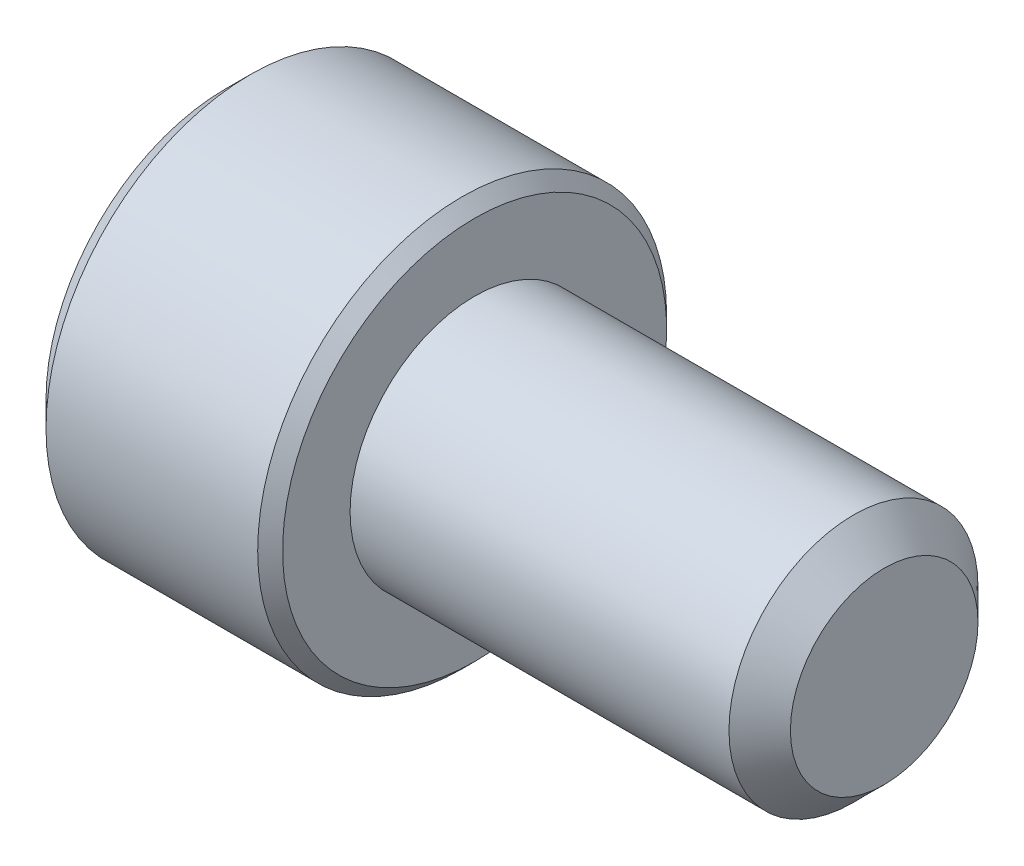
ISO-10303-21;
HEADER;
FILE_DESCRIPTION(('STEP AP214'),'2;1');
FILE_NAME('part.step','',(''),(''),'','','');
FILE_SCHEMA(('AUTOMOTIVE_DESIGN { 1 0 10303 214 1 1 1 1 }'));
ENDSEC;
DATA;
#1=APPLICATION_CONTEXT('core data for automotive mechanical design processes');
#2=APPLICATION_PROTOCOL_DEFINITION('international standard','automotive_design',2000,#1);
#3=PRODUCT_CONTEXT('',#1,'mechanical');
#4=PRODUCT('Part','Part','',(#3));
#5=PRODUCT_RELATED_PRODUCT_CATEGORY('part','',(#4));
#6=PRODUCT_DEFINITION_FORMATION('','',#4);
#7=PRODUCT_DEFINITION_CONTEXT('part definition',#1,'design');
#8=PRODUCT_DEFINITION('design','',#6,#7);
#9=PRODUCT_DEFINITION_SHAPE('','',#8);
#10=(LENGTH_UNIT() NAMED_UNIT(*) SI_UNIT(.MILLI.,.METRE.));
#11=(NAMED_UNIT(*) PLANE_ANGLE_UNIT() SI_UNIT($,.RADIAN.));
#12=(NAMED_UNIT(*) SI_UNIT($,.STERADIAN.) SOLID_ANGLE_UNIT());
#13=UNCERTAINTY_MEASURE_WITH_UNIT(LENGTH_MEASURE(1.E-05),#10,'distance_accuracy_value','');
#14=(GEOMETRIC_REPRESENTATION_CONTEXT(3) GLOBAL_UNCERTAINTY_ASSIGNED_CONTEXT((#13)) GLOBAL_UNIT_ASSIGNED_CONTEXT((#10,
#11,#12)) REPRESENTATION_CONTEXT('',''));
#15=CARTESIAN_POINT('',(0.,0.,0.));
#16=DIRECTION('',(0.,0.,1.));
#17=DIRECTION('',(1.,0.,0.));
#18=AXIS2_PLACEMENT_3D('',#15,#16,#17);
#19=CARTESIAN_POINT('',(-8.79475,3.4798,0.));
#20=DIRECTION('',(-1.,0.,0.));
#21=DIRECTION('',(0.,-1.,0.));
#22=AXIS2_PLACEMENT_3D('',#19,#20,#21);
#23=PLANE('',#22);
#24=CARTESIAN_POINT('',(-8.79475,0.,0.));
#25=DIRECTION('',(-1.,0.,0.));
#26=DIRECTION('',(0.,-1.,0.));
#27=AXIS2_PLACEMENT_3D('',#24,#25,#26);
#28=CIRCLE('',#27,2.29135888084631);
#29=CARTESIAN_POINT('',(-8.79475000000001,-2.29135888084629,0.));
#30=VERTEX_POINT('',#29);
#31=CARTESIAN_POINT('',(-8.79475,-1.1456794404232,1.98437499999995));
#32=VERTEX_POINT('',#31);
#33=EDGE_CURVE('E134',#30,#32,#28,.T.);
#34=ORIENTED_EDGE('',*,*,#33,.F.);
#35=CARTESIAN_POINT('',(-8.79475,-1.14567944042316,-1.984375));
#36=VERTEX_POINT('',#35);
#37=EDGE_CURVE('E133',#36,#30,#28,.T.);
#38=ORIENTED_EDGE('',*,*,#37,.F.);
#39=CARTESIAN_POINT('',(-8.79475,1.14567944042314,-1.984375));
#40=VERTEX_POINT('',#39);
#41=EDGE_CURVE('E102',#40,#36,#28,.T.);
#42=ORIENTED_EDGE('',*,*,#41,.F.);
#43=CARTESIAN_POINT('',(-8.79474999999999,2.29135888084633,0.));
#44=VERTEX_POINT('',#43);
#45=EDGE_CURVE('E95',#44,#40,#28,.T.);
#46=ORIENTED_EDGE('',*,*,#45,.F.);
#47=CARTESIAN_POINT('',(-8.79475,1.14567944042314,1.984375));
#48=VERTEX_POINT('',#47);
#49=EDGE_CURVE('E56',#48,#44,#28,.T.);
#50=ORIENTED_EDGE('',*,*,#49,.F.);
#51=EDGE_CURVE('E63',#32,#48,#28,.T.);
#52=ORIENTED_EDGE('',*,*,#51,.F.);
#53=EDGE_LOOP('',(#34,#38,#42,#46,#50,#52));
#54=FACE_BOUND('',#53,.T.);
#55=CARTESIAN_POINT('',(-8.79475,0.,0.));
#56=DIRECTION('',(1.,0.,0.));
#57=DIRECTION('',(0.,1.,0.));
#58=AXIS2_PLACEMENT_3D('',#55,#56,#57);
#59=CIRCLE('',#58,3.4798);
#60=CARTESIAN_POINT('',(-8.79475,3.4798,0.));
#61=VERTEX_POINT('',#60);
#62=EDGE_CURVE('E227',#61,#61,#59,.T.);
#63=ORIENTED_EDGE('',*,*,#62,.F.);
#64=EDGE_LOOP('',(#63));
#65=FACE_BOUND('',#64,.T.);
#66=ADVANCED_FACE('F36',(#54,#65),#23,.T.);
#67=CARTESIAN_POINT('',(-3.96875,0.,0.));
#68=DIRECTION('',(1.,0.,0.));
#69=DIRECTION('',(0.,0.,-1.));
#70=AXIS2_PLACEMENT_3D('',#67,#68,#69);
#71=CYLINDRICAL_SURFACE('',#70,2.413);
#72=CARTESIAN_POINT('',(3.3734375,0.,0.));
#73=DIRECTION('',(1.,0.,0.));
#74=DIRECTION('',(0.,0.,-1.));
#75=AXIS2_PLACEMENT_3D('',#72,#73,#74);
#76=CIRCLE('',#75,2.413);
#77=CARTESIAN_POINT('',(3.3734375,0.,-2.413));
#78=VERTEX_POINT('',#77);
#79=EDGE_CURVE('E50',#78,#78,#76,.F.);
#80=ORIENTED_EDGE('',*,*,#79,.T.);
#81=EDGE_LOOP('',(#80));
#82=FACE_BOUND('',#81,.T.);
#83=CARTESIAN_POINT('',(-3.96875,0.,0.));
#84=DIRECTION('',(1.,0.,0.));
#85=DIRECTION('',(0.,1.,0.));
#86=AXIS2_PLACEMENT_3D('',#83,#84,#85);
#87=CIRCLE('',#86,2.413);
#88=CARTESIAN_POINT('',(-3.96875,2.41299999999999,0.));
#89=VERTEX_POINT('',#88);
#90=EDGE_CURVE('E220',#89,#89,#87,.F.);
#91=ORIENTED_EDGE('',*,*,#90,.F.);
#92=EDGE_LOOP('',(#91));
#93=FACE_BOUND('',#92,.T.);
#94=ADVANCED_FACE('F200',(#82,#93),#71,.T.);
#95=CARTESIAN_POINT('',(3.96875,0.,0.));
#96=DIRECTION('',(1.,0.,0.));
#97=DIRECTION('',(0.,0.,-1.));
#98=AXIS2_PLACEMENT_3D('',#95,#96,#97);
#99=PLANE('',#98);
#100=CARTESIAN_POINT('',(3.96875,0.,0.));
#101=DIRECTION('',(1.,0.,0.));
#102=DIRECTION('',(0.,0.,-1.));
#103=AXIS2_PLACEMENT_3D('',#100,#101,#102);
#104=CIRCLE('',#103,1.8176875);
#105=CARTESIAN_POINT('',(3.96875,0.,-1.8176875));
#106=VERTEX_POINT('',#105);
#107=EDGE_CURVE('E221',#106,#106,#104,.T.);
#108=ORIENTED_EDGE('',*,*,#107,.T.);
#109=EDGE_LOOP('',(#108));
#110=FACE_BOUND('',#109,.T.);
#111=ADVANCED_FACE('F208',(#110),#99,.T.);
#112=CARTESIAN_POINT('',(3.96875,0.,0.));
#113=DIRECTION('',(-1.,0.,0.));
#114=DIRECTION('',(0.,0.,1.));
#115=AXIS2_PLACEMENT_3D('',#112,#113,#114);
#116=CONICAL_SURFACE('',#115,1.8176875,0.785398163397448);
#117=ORIENTED_EDGE('',*,*,#79,.F.);
#118=EDGE_LOOP('',(#117));
#119=FACE_BOUND('',#118,.T.);
#120=ORIENTED_EDGE('',*,*,#107,.F.);
#121=EDGE_LOOP('',(#120));
#122=FACE_BOUND('',#121,.T.);
#123=ADVANCED_FACE('F38',(#119,#122),#116,.T.);
#124=CARTESIAN_POINT('',(-3.96875,0.,0.));
#125=DIRECTION('',(1.,0.,0.));
#126=DIRECTION('',(0.,1.,0.));
#127=AXIS2_PLACEMENT_3D('',#124,#125,#126);
#128=CYLINDRICAL_SURFACE('',#127,3.9624);
#129=CARTESIAN_POINT('',(-8.31215,0.,0.));
#130=DIRECTION('',(1.,0.,0.));
#131=DIRECTION('',(0.,1.,0.));
#132=AXIS2_PLACEMENT_3D('',#129,#130,#131);
#133=CIRCLE('',#132,3.9624);
#134=CARTESIAN_POINT('',(-8.31215,3.9624,0.));
#135=VERTEX_POINT('',#134);
#136=EDGE_CURVE('E222',#135,#135,#133,.T.);
#137=ORIENTED_EDGE('',*,*,#136,.T.);
#138=EDGE_LOOP('',(#137));
#139=FACE_BOUND('',#138,.T.);
#140=CARTESIAN_POINT('',(-4.21005,0.,0.));
#141=DIRECTION('',(1.,0.,0.));
#142=DIRECTION('',(0.,1.,0.));
#143=AXIS2_PLACEMENT_3D('',#140,#141,#142);
#144=CIRCLE('',#143,3.9624);
#145=CARTESIAN_POINT('',(-4.21005,3.9624,0.));
#146=VERTEX_POINT('',#145);
#147=EDGE_CURVE('E236',#146,#146,#144,.T.);
#148=ORIENTED_EDGE('',*,*,#147,.F.);
#149=EDGE_LOOP('',(#148));
#150=FACE_BOUND('',#149,.T.);
#151=ADVANCED_FACE('F203',(#139,#150),#128,.T.);
#152=CARTESIAN_POINT('',(-8.31215,0.,0.));
#153=DIRECTION('',(1.,0.,0.));
#154=DIRECTION('',(0.,1.,0.));
#155=AXIS2_PLACEMENT_3D('',#152,#153,#154);
#156=CONICAL_SURFACE('',#155,3.9624,0.78539816339745);
#157=ORIENTED_EDGE('',*,*,#62,.T.);
#158=EDGE_LOOP('',(#157));
#159=FACE_BOUND('',#158,.T.);
#160=ORIENTED_EDGE('',*,*,#136,.F.);
#161=EDGE_LOOP('',(#160));
#162=FACE_BOUND('',#161,.T.);
#163=ADVANCED_FACE('F196',(#159,#162),#156,.T.);
#164=CARTESIAN_POINT('',(-3.96875,3.7211,0.));
#165=DIRECTION('',(1.,0.,0.));
#166=DIRECTION('',(0.,1.,0.));
#167=AXIS2_PLACEMENT_3D('',#164,#165,#166);
#168=PLANE('',#167);
#169=ORIENTED_EDGE('',*,*,#90,.T.);
#170=EDGE_LOOP('',(#169));
#171=FACE_BOUND('',#170,.T.);
#172=CARTESIAN_POINT('',(-3.96875,0.,0.));
#173=DIRECTION('',(1.,0.,0.));
#174=DIRECTION('',(0.,1.,0.));
#175=AXIS2_PLACEMENT_3D('',#172,#173,#174);
#176=CIRCLE('',#175,3.7211);
#177=CARTESIAN_POINT('',(-3.96875,3.7211,0.));
#178=VERTEX_POINT('',#177);
#179=EDGE_CURVE('E233',#178,#178,#176,.T.);
#180=ORIENTED_EDGE('',*,*,#179,.T.);
#181=EDGE_LOOP('',(#180));
#182=FACE_BOUND('',#181,.T.);
#183=ADVANCED_FACE('F192',(#171,#182),#168,.T.);
#184=CARTESIAN_POINT('',(-3.96875,0.,0.));
#185=DIRECTION('',(-1.,0.,0.));
#186=DIRECTION('',(0.,-1.,0.));
#187=AXIS2_PLACEMENT_3D('',#184,#185,#186);
#188=CONICAL_SURFACE('',#187,3.7211,0.785398163397453);
#189=ORIENTED_EDGE('',*,*,#147,.T.);
#190=EDGE_LOOP('',(#189));
#191=FACE_BOUND('',#190,.T.);
#192=ORIENTED_EDGE('',*,*,#179,.F.);
#193=EDGE_LOOP('',(#192));
#194=FACE_BOUND('',#193,.T.);
#195=ADVANCED_FACE('F156',(#191,#194),#188,.T.);
#196=CARTESIAN_POINT('',(-8.79475,0.,0.));
#197=DIRECTION('',(-1.,0.,0.));
#198=DIRECTION('',(0.,-1.,0.));
#199=AXIS2_PLACEMENT_3D('',#196,#197,#198);
#200=CONICAL_SURFACE('',#199,2.29135888084631,0.78539816339745);
#201=CARTESIAN_POINT('',(-9.55676229336038,-2.3206316784124,-1.984375));
#202=CARTESIAN_POINT('',(-9.51394707270642,-2.26428478882583,-1.984375));
#203=CARTESIAN_POINT('',(-9.47153515492394,-2.20762644057207,-1.984375));
#204=CARTESIAN_POINT('',(-9.38769976145879,-2.09356244128209,-1.984375));
#205=CARTESIAN_POINT('',(-9.34627653152968,-2.03615660981659,-1.984375));
#206=CARTESIAN_POINT('',(-9.26430560751588,-1.92005329556712,-1.984375));
#207=CARTESIAN_POINT('',(-9.22376717145536,-1.86134925449791,-1.984375));
#208=CARTESIAN_POINT('',(-9.14416769497068,-1.7429510853472,-1.984375));
#209=CARTESIAN_POINT('',(-9.10510655113528,-1.6832570269898,-1.984375));
#210=CARTESIAN_POINT('',(-9.02653250731771,-1.5591477373728,-1.984375));
#211=CARTESIAN_POINT('',(-8.98712992174023,-1.49466231064595,-1.984375));
#212=CARTESIAN_POINT('',(-8.91086530872313,-1.3641815068518,-1.984375));
#213=CARTESIAN_POINT('',(-8.87400373660622,-1.2981858619768,-1.984375));
#214=CARTESIAN_POINT('',(-8.80361630444402,-1.16468832200843,-1.984375));
#215=CARTESIAN_POINT('',(-8.77008041857874,-1.09719175478192,-1.984375));
#216=CARTESIAN_POINT('',(-8.70708838834422,-0.960326048786327,-1.984375));
#217=CARTESIAN_POINT('',(-8.67763087331822,-0.890957548546735,-1.984375));
#218=CARTESIAN_POINT('',(-8.6261931504457,-0.756350570613422,-1.984375));
#219=CARTESIAN_POINT('',(-8.60378560019979,-0.691277091857547,-1.984375));
#220=CARTESIAN_POINT('',(-8.5641864385565,-0.559532244369913,-1.984375));
#221=CARTESIAN_POINT('',(-8.54699517673117,-0.492860768870557,-1.984375));
#222=CARTESIAN_POINT('',(-8.51902331073016,-0.359444340575319,-1.984375));
#223=CARTESIAN_POINT('',(-8.50813066126806,-0.292723272477119,-1.984375));
#224=CARTESIAN_POINT('',(-8.49297313390981,-0.158528474649768,-1.984375));
#225=CARTESIAN_POINT('',(-8.48870704065993,-0.0910548852248758,-1.984375));
#226=CARTESIAN_POINT('',(-8.48713540955641,0.0413650998667501,-1.984375));
#227=CARTESIAN_POINT('',(-8.48956740391609,0.106308452919117,-1.984375));
#228=CARTESIAN_POINT('',(-8.50067013793681,0.235655862955959,-1.984375));
#229=CARTESIAN_POINT('',(-8.50934147115444,0.300059868041808,-1.984375));
#230=CARTESIAN_POINT('',(-8.53259074346061,0.428953283908064,-1.984375));
#231=CARTESIAN_POINT('',(-8.54727045881754,0.493424050400076,-1.984375));
#232=CARTESIAN_POINT('',(-8.58174556579777,0.620952380179842,-1.984375));
#233=CARTESIAN_POINT('',(-8.60154057481996,0.68401004877784,-1.984375));
#234=CARTESIAN_POINT('',(-8.67085089141761,0.88094055847438,-1.984375));
#235=CARTESIAN_POINT('',(-8.7281930119387,1.01205007095366,-1.984375));
#236=CARTESIAN_POINT('',(-8.85572967424588,1.26813381464483,-1.984375));
#237=CARTESIAN_POINT('',(-8.92597007068505,1.39308407226709,-1.984375));
#238=CARTESIAN_POINT('',(-9.03561245528437,1.57369086898221,-1.984375));
#239=CARTESIAN_POINT('',(-9.07185575114648,1.63130328176364,-1.984375));
#240=CARTESIAN_POINT('',(-9.14588044244426,1.74553911363298,-1.984375));
#241=CARTESIAN_POINT('',(-9.18366195397286,1.80216245761083,-1.984375));
#242=CARTESIAN_POINT('',(-9.26017086580001,1.91409137769694,-1.984375));
#243=CARTESIAN_POINT('',(-9.29888814316296,1.96940390813264,-1.984375));
#244=CARTESIAN_POINT('',(-9.37735196518062,2.07927192329344,-1.984375));
#245=CARTESIAN_POINT('',(-9.41709822354826,2.1338276122379,-1.984375));
#246=CARTESIAN_POINT('',(-9.45726618178775,2.18806621129858,-1.984375));
#247=B_SPLINE_CURVE_WITH_KNOTS('',3,(#201,#202,#203,#204,#205,#206,#207,#208,#209,#210,#211,
#212,#213,#214,#215,#216,#217,#218,#219,#220,#221,#222,#223,#224,#225,#226,#227,#228,#229,#230,
#231,#232,#233,#234,#235,#236,#237,#238,#239,#240,#241,#242,#243,#244,#245,#246),.UNSPECIFIED.,
.F.,.F.,(4,2,2,2,2,2,2,2,2,2,2,2,2,2,2,2,2,2,2,2,2,2,4),(0.,0.212308206708488,0.424668647589504,
0.63867273174274,0.852661807665257,1.07932739843288,1.3060335002603,1.53203394151129,
1.75795824331226,1.96424818314073,2.17055194453601,2.37306294932148,2.57553680787774,
2.77019069749413,2.96486310724197,3.16297934088123,3.36108076059801,3.78913334543529,
4.21873824515622,4.42291226709442,4.62710172722025,4.82963956116389,5.03212163733124),.UNSPECIFIED.);
#248=EDGE_CURVE('E11',#36,#40,#247,.T.);
#249=ORIENTED_EDGE('',*,*,#248,.T.);
#250=ORIENTED_EDGE('',*,*,#41,.T.);
#251=EDGE_LOOP('',(#249,#250));
#252=FACE_BOUND('',#251,.T.);
#253=ADVANCED_FACE('F107',(#252),#200,.F.);
#254=CARTESIAN_POINT('',(-8.79486547878189,-2.29147435090016,0.000200000000000217));
#255=CARTESIAN_POINT('',(-8.75551285226396,-2.25208982772757,-0.0680159951668023));
#256=CARTESIAN_POINT('',(-8.71847131044623,-2.21204672412052,-0.137372685106966));
#257=CARTESIAN_POINT('',(-8.65064885842337,-2.13039431835551,-0.278798800452189));
#258=CARTESIAN_POINT('',(-8.6199056890918,-2.08877724917394,-0.350881678736785));
#259=CARTESIAN_POINT('',(-8.56724188881126,-2.00485839535391,-0.496233397266008));
#260=CARTESIAN_POINT('',(-8.54518887588001,-1.96257798712286,-0.569465212486943));
#261=CARTESIAN_POINT('',(-8.51121149294392,-1.87708628592063,-0.717541182594711));
#262=CARTESIAN_POINT('',(-8.49926175609177,-1.83387760530244,-0.79238081275343));
#263=CARTESIAN_POINT('',(-8.48848009908195,-1.75941119748879,-0.921360414543822));
#264=CARTESIAN_POINT('',(-8.48688389905911,-1.72824969749539,-0.975333715772449));
#265=CARTESIAN_POINT('',(-8.48957183886533,-1.66597761963483,-1.08319211851981));
#266=CARTESIAN_POINT('',(-8.4938580403405,-1.63486706344892,-1.13707718248553));
#267=CARTESIAN_POINT('',(-8.50806687301356,-1.57293969082547,-1.24433853824861));
#268=CARTESIAN_POINT('',(-8.51799581045232,-1.54212324232506,-1.29771419276015));
#269=CARTESIAN_POINT('',(-8.54294508427458,-1.48102323060121,-1.40354251740891));
#270=CARTESIAN_POINT('',(-8.55796503038953,-1.45073962671789,-1.45599525797111));
#271=CARTESIAN_POINT('',(-8.60255785163571,-1.37316564308796,-1.59035733896366));
#272=CARTESIAN_POINT('',(-8.63549299593837,-1.32635638215844,-1.67143335715833));
#273=CARTESIAN_POINT('',(-8.69109244120224,-1.2575275989319,-1.79064830672984));
#274=CARTESIAN_POINT('',(-8.7106275920519,-1.23484545965257,-1.829934924386));
#275=CARTESIAN_POINT('',(-8.75147873811944,-1.18990137536712,-1.90778036186805));
#276=CARTESIAN_POINT('',(-8.77279363956839,-1.16763918244233,-1.9463396111017));
#277=CARTESIAN_POINT('',(-8.79486547878188,-1.14556397036933,-1.984575));
#278=B_SPLINE_CURVE_WITH_KNOTS('',3,(#254,#255,#256,#257,#258,#259,#260,#261,#262,#263,#264,
#265,#266,#267,#268,#269,#270,#271,#272,#273,#274,#275,#276,#277),.UNSPECIFIED.,.F.,.F.,(4,2,2,
2,2,2,2,2,2,2,2,4),(0.,0.264339630306628,0.530219665093699,0.791876416371467,1.0528742441811,
1.23963984393201,1.42647091743853,1.61351120244036,1.80053715247542,2.09764209964317,
2.24579179873714,2.39385111134157),.UNSPECIFIED.);
#279=EDGE_CURVE('E136',#30,#36,#278,.T.);
#280=ORIENTED_EDGE('',*,*,#279,.T.);
#281=ORIENTED_EDGE('',*,*,#37,.T.);
#282=EDGE_LOOP('',(#280,#281));
#283=FACE_BOUND('',#282,.T.);
#284=ADVANCED_FACE('F155',(#283),#200,.F.);
#285=CARTESIAN_POINT('',(-8.79486547878188,-1.14556397036933,1.984575));
#286=CARTESIAN_POINT('',(-8.75551285226395,-1.18494849354192,1.9163590048332));
#287=CARTESIAN_POINT('',(-8.71847131044622,-1.22499159714897,1.84700231489303));
#288=CARTESIAN_POINT('',(-8.65064885842336,-1.30664400291398,1.70557619954781));
#289=CARTESIAN_POINT('',(-8.61990568909179,-1.34826107209555,1.63349332126322));
#290=CARTESIAN_POINT('',(-8.56724188881125,-1.43217992591557,1.488141602734));
#291=CARTESIAN_POINT('',(-8.54518887588,-1.47446033414662,1.41490978751307));
#292=CARTESIAN_POINT('',(-8.51121149294392,-1.55995203534886,1.2668338174053));
#293=CARTESIAN_POINT('',(-8.49926175609177,-1.60316071596704,1.19199418724658));
#294=CARTESIAN_POINT('',(-8.48848009908195,-1.6776271237807,1.06301458545619));
#295=CARTESIAN_POINT('',(-8.48688389905911,-1.7087886237741,1.00904128422756));
#296=CARTESIAN_POINT('',(-8.48957183886534,-1.77106070163465,0.901182881480204));
#297=CARTESIAN_POINT('',(-8.4938580403405,-1.80217125782056,0.847297817514481));
#298=CARTESIAN_POINT('',(-8.50806687301356,-1.86409863044402,0.7400364617514));
#299=CARTESIAN_POINT('',(-8.51799581045232,-1.89491507894443,0.686660807239863));
#300=CARTESIAN_POINT('',(-8.54294508427458,-1.95601509066827,0.580832482591107));
#301=CARTESIAN_POINT('',(-8.55796503038953,-1.9862986945516,0.528379742028901));
#302=CARTESIAN_POINT('',(-8.60255785163572,-2.06387267818152,0.394017661036353));
#303=CARTESIAN_POINT('',(-8.63549299593838,-2.11068193911104,0.312941642841677));
#304=CARTESIAN_POINT('',(-8.69109244120224,-2.17951072233758,0.193726693270162));
#305=CARTESIAN_POINT('',(-8.71062759205191,-2.20219286161692,0.154440075614));
#306=CARTESIAN_POINT('',(-8.75147873811945,-2.24713694590237,0.0765946381319477));
#307=CARTESIAN_POINT('',(-8.7727936395684,-2.26939913882716,0.0380353888983019));
#308=CARTESIAN_POINT('',(-8.79486547878189,-2.29147435090016,-0.000199999999999746));
#309=B_SPLINE_CURVE_WITH_KNOTS('',3,(#285,#286,#287,#288,#289,#290,#291,#292,#293,#294,#295,
#296,#297,#298,#299,#300,#301,#302,#303,#304,#305,#306,#307,#308),.UNSPECIFIED.,.F.,.F.,(4,2,2,
2,2,2,2,2,2,2,2,4),(0.,0.264339630306625,0.530219665093689,0.791876416371453,1.05287424418108,
1.23963984393199,1.42647091743851,1.61351120244034,1.8005371524754,2.09764209964316,
2.24579179873713,2.39385111134157),.UNSPECIFIED.);
#310=EDGE_CURVE('E143',#32,#30,#309,.T.);
#311=ORIENTED_EDGE('',*,*,#310,.T.);
#312=ORIENTED_EDGE('',*,*,#33,.T.);
#313=EDGE_LOOP('',(#311,#312));
#314=FACE_BOUND('',#313,.T.);
#315=ADVANCED_FACE('F279',(#314),#200,.F.);
#316=CARTESIAN_POINT('',(-9.55676229329094,-2.32063167832104,1.984375));
#317=CARTESIAN_POINT('',(-9.51394707263966,-2.26428478873706,1.984375));
#318=CARTESIAN_POINT('',(-9.47153515485986,-2.20762644048589,1.984375));
#319=CARTESIAN_POINT('',(-9.38769976140004,-2.09356244120113,1.984375));
#320=CARTESIAN_POINT('',(-9.34627653147359,-2.03615660973825,1.984375));
#321=CARTESIAN_POINT('',(-9.26430560746513,-1.92005329549412,1.984375));
#322=CARTESIAN_POINT('',(-9.22376717140729,-1.86134925442762,1.984375));
#323=CARTESIAN_POINT('',(-9.14416769492792,-1.74295108528238,1.984375));
#324=CARTESIAN_POINT('',(-9.10510655109516,-1.68325702692774,1.984375));
#325=CARTESIAN_POINT('',(-9.02653250728308,-1.5591477373167,1.984375));
#326=CARTESIAN_POINT('',(-8.98712992170844,-1.49466231059305,1.984375));
#327=CARTESIAN_POINT('',(-8.91086530869689,-1.36418150680542,1.984375));
#328=CARTESIAN_POINT('',(-8.8740037365827,-1.29818586193374,1.984375));
#329=CARTESIAN_POINT('',(-8.80361630442569,-1.16468832197212,1.984375));
#330=CARTESIAN_POINT('',(-8.7700804185629,-1.09719175474904,1.984375));
#331=CARTESIAN_POINT('',(-8.70708838833304,-0.960326048760504,1.984375));
#332=CARTESIAN_POINT('',(-8.67763087330922,-0.890957548524531,1.984375));
#333=CARTESIAN_POINT('',(-8.62619315043828,-0.756350570592765,1.984375));
#334=CARTESIAN_POINT('',(-8.60378560019219,-0.691277091834656,1.984375));
#335=CARTESIAN_POINT('',(-8.56418643854898,-0.559532244342477,1.984375));
#336=CARTESIAN_POINT('',(-8.54699517672392,-0.49286076884081,1.984375));
#337=CARTESIAN_POINT('',(-8.51902331072397,-0.359444340541024,1.984375));
#338=CARTESIAN_POINT('',(-8.50813066126265,-0.292723272440587,1.984375));
#339=CARTESIAN_POINT('',(-8.49297313390647,-0.158528474608833,1.984375));
#340=CARTESIAN_POINT('',(-8.48870704065788,-0.0910548851817749,1.984375));
#341=CARTESIAN_POINT('',(-8.48713540955733,0.0413650999137399,1.984375));
#342=CARTESIAN_POINT('',(-8.48956740391865,0.106308452967835,1.984375));
#343=CARTESIAN_POINT('',(-8.50067013794289,0.235655863007954,1.984375));
#344=CARTESIAN_POINT('',(-8.50934147116241,0.300059868095352,1.984375));
#345=CARTESIAN_POINT('',(-8.53259074347253,0.428953283964665,1.984375));
#346=CARTESIAN_POINT('',(-8.54727045883154,0.49342405045818,1.984375));
#347=CARTESIAN_POINT('',(-8.58174556581596,0.620952380240804,1.984375));
#348=CARTESIAN_POINT('',(-8.60154057484026,0.684010048840155,1.984375));
#349=CARTESIAN_POINT('',(-8.67085089144782,0.880940558550147,1.984375));
#350=CARTESIAN_POINT('',(-8.72819301197801,1.01205007104085,1.984375));
#351=CARTESIAN_POINT('',(-8.85572967430439,1.268133814754,1.984375));
#352=CARTESIAN_POINT('',(-8.92597007075368,1.3930840723868,1.984375));
#353=CARTESIAN_POINT('',(-9.03561245536781,1.57369086911654,1.984375));
#354=CARTESIAN_POINT('',(-9.07185575123449,1.63130328190225,1.984375));
#355=CARTESIAN_POINT('',(-9.1458804425414,1.74553911378008,1.984375));
#356=CARTESIAN_POINT('',(-9.18366195407458,1.80216245776215,1.984375));
#357=CARTESIAN_POINT('',(-9.26017086591083,1.91409137785659,1.984375));
#358=CARTESIAN_POINT('',(-9.29888814327831,1.96940390829639,1.984375));
#359=CARTESIAN_POINT('',(-9.37735196530501,2.0792719234654,1.984375));
#360=CARTESIAN_POINT('',(-9.41709822367718,2.13382761241394,1.984375));
#361=CARTESIAN_POINT('',(-9.45726618192118,2.1880662114787,1.984375));
#362=B_SPLINE_CURVE_WITH_KNOTS('',3,(#316,#317,#318,#319,#320,#321,#322,#323,#324,#325,#326,
#327,#328,#329,#330,#331,#332,#333,#334,#335,#336,#337,#338,#339,#340,#341,#342,#343,#344,#345,
#346,#347,#348,#349,#350,#351,#352,#353,#354,#355,#356,#357,#358,#359,#360,#361),.UNSPECIFIED.,
.F.,.F.,(4,2,2,2,2,2,2,2,2,2,2,2,2,2,2,2,2,2,2,2,2,2,4),(0.,0.21230820669744,0.424668647567405,
0.638672731709378,0.852661807620637,1.07932739837562,1.30603350019039,1.53203394142884,
1.7579582432173,1.96424818305225,2.17055194445402,2.37306294924569,2.57553680780815,
2.77019069742989,2.96486310718308,3.16297934082811,3.36108076055066,3.7891333454301,
4.21873824519347,4.42291226714981,4.62710172729378,4.82963956125532,5.03212163744057),.UNSPECIFIED.);
#363=EDGE_CURVE('E163',#48,#32,#362,.F.);
#364=ORIENTED_EDGE('',*,*,#363,.T.);
#365=ORIENTED_EDGE('',*,*,#51,.T.);
#366=EDGE_LOOP('',(#364,#365));
#367=FACE_BOUND('',#366,.T.);
#368=ADVANCED_FACE('F286',(#367),#200,.F.);
#369=CARTESIAN_POINT('',(-8.79486547878184,2.29147435090016,-0.000199999999999741));
#370=CARTESIAN_POINT('',(-8.75551285226391,2.25208982772757,0.0680159951668026));
#371=CARTESIAN_POINT('',(-8.71847131044618,2.21204672412052,0.137372685106965));
#372=CARTESIAN_POINT('',(-8.65064885842332,2.13039431835551,0.278798800452186));
#373=CARTESIAN_POINT('',(-8.61990568909175,2.08877724917394,0.35088167873678));
#374=CARTESIAN_POINT('',(-8.56724188881121,2.00485839535392,0.496233397266));
#375=CARTESIAN_POINT('',(-8.54518887587996,1.96257798712287,0.569465212486934));
#376=CARTESIAN_POINT('',(-8.51121149294387,1.87708628592063,0.717541182594701));
#377=CARTESIAN_POINT('',(-8.49926175609173,1.83387760530245,0.792380812753419));
#378=CARTESIAN_POINT('',(-8.4884800990819,1.75941119748879,0.921360414543809));
#379=CARTESIAN_POINT('',(-8.48688389905907,1.72824969749539,0.975333715772435));
#380=CARTESIAN_POINT('',(-8.48957183886529,1.66597761963484,1.08319211851979));
#381=CARTESIAN_POINT('',(-8.49385804034046,1.63486706344893,1.13707718248552));
#382=CARTESIAN_POINT('',(-8.50806687301352,1.57293969082548,1.2443385382486));
#383=CARTESIAN_POINT('',(-8.51799581045227,1.54212324232507,1.29771419276013));
#384=CARTESIAN_POINT('',(-8.54294508427454,1.48102323060122,1.40354251740889));
#385=CARTESIAN_POINT('',(-8.55796503038949,1.4507396267179,1.45599525797109));
#386=CARTESIAN_POINT('',(-8.60255785163567,1.37316564308797,1.59035733896364));
#387=CARTESIAN_POINT('',(-8.63549299593834,1.32635638215845,1.67143335715832));
#388=CARTESIAN_POINT('',(-8.6910924412022,1.25752759893191,1.79064830672984));
#389=CARTESIAN_POINT('',(-8.71062759205187,1.23484545965257,1.829934924386));
#390=CARTESIAN_POINT('',(-8.75147873811941,1.18990137536713,1.90778036186805));
#391=CARTESIAN_POINT('',(-8.77279363956836,1.16763918244233,1.9463396111017));
#392=CARTESIAN_POINT('',(-8.79486547878185,1.14556397036933,1.984575));
#393=B_SPLINE_CURVE_WITH_KNOTS('',3,(#369,#370,#371,#372,#373,#374,#375,#376,#377,#378,#379,
#380,#381,#382,#383,#384,#385,#386,#387,#388,#389,#390,#391,#392),.UNSPECIFIED.,.F.,.F.,(4,2,2,
2,2,2,2,2,2,2,2,4),(0.,0.264339630306624,0.53021966509369,0.791876416371453,1.05287424418108,
1.23963984393199,1.42647091743851,1.61351120244033,1.80053715247539,2.09764209964316,
2.24579179873713,2.39385111134157),.UNSPECIFIED.);
#394=EDGE_CURVE('E122',#44,#48,#393,.T.);
#395=ORIENTED_EDGE('',*,*,#394,.T.);
#396=ORIENTED_EDGE('',*,*,#49,.T.);
#397=EDGE_LOOP('',(#395,#396));
#398=FACE_BOUND('',#397,.T.);
#399=ADVANCED_FACE('F293',(#398),#200,.F.);
#400=CARTESIAN_POINT('',(-8.79486547878185,1.14556397036933,-1.984575));
#401=CARTESIAN_POINT('',(-8.75551285226392,1.18494849354192,-1.9163590048332));
#402=CARTESIAN_POINT('',(-8.71847131044619,1.22499159714897,-1.84700231489303));
#403=CARTESIAN_POINT('',(-8.65064885842333,1.30664400291398,-1.70557619954781));
#404=CARTESIAN_POINT('',(-8.61990568909176,1.34826107209556,-1.63349332126321));
#405=CARTESIAN_POINT('',(-8.56724188881122,1.43217992591558,-1.48814160273399));
#406=CARTESIAN_POINT('',(-8.54518887587996,1.47446033414663,-1.41490978751306));
#407=CARTESIAN_POINT('',(-8.51121149294388,1.55995203534886,-1.26683381740529));
#408=CARTESIAN_POINT('',(-8.49926175609173,1.60316071596705,-1.19199418724657));
#409=CARTESIAN_POINT('',(-8.48848009908191,1.6776271237807,-1.06301458545618));
#410=CARTESIAN_POINT('',(-8.48688389905907,1.7087886237741,-1.00904128422755));
#411=CARTESIAN_POINT('',(-8.48957183886529,1.77106070163465,-0.901182881480193));
#412=CARTESIAN_POINT('',(-8.49385804034046,1.80217125782057,-0.84729781751447));
#413=CARTESIAN_POINT('',(-8.50806687301352,1.86409863044402,-0.74003646175139));
#414=CARTESIAN_POINT('',(-8.51799581045227,1.89491507894443,-0.686660807239854));
#415=CARTESIAN_POINT('',(-8.54294508427454,1.95601509066828,-0.580832482591098));
#416=CARTESIAN_POINT('',(-8.55796503038949,1.9862986945516,-0.528379742028894));
#417=CARTESIAN_POINT('',(-8.60255785163567,2.06387267818152,-0.394017661036347));
#418=CARTESIAN_POINT('',(-8.63549299593833,2.11068193911104,-0.312941642841673));
#419=CARTESIAN_POINT('',(-8.69109244120219,2.17951072233758,-0.193726693270159));
#420=CARTESIAN_POINT('',(-8.71062759205186,2.20219286161692,-0.154440075613998));
#421=CARTESIAN_POINT('',(-8.7514787381194,2.24713694590237,-0.0765946381319469));
#422=CARTESIAN_POINT('',(-8.77279363956834,2.26939913882716,-0.0380353888983013));
#423=CARTESIAN_POINT('',(-8.79486547878184,2.29147435090016,0.000200000000000198));
#424=B_SPLINE_CURVE_WITH_KNOTS('',3,(#400,#401,#402,#403,#404,#405,#406,#407,#408,#409,#410,
#411,#412,#413,#414,#415,#416,#417,#418,#419,#420,#421,#422,#423),.UNSPECIFIED.,.F.,.F.,(4,2,2,
2,2,2,2,2,2,2,2,4),(0.,0.26433963030663,0.530219665093699,0.791876416371468,1.0528742441811,
1.23963984393201,1.42647091743853,1.61351120244035,1.80053715247541,2.09764209964316,
2.24579179873714,2.39385111134157),.UNSPECIFIED.);
#425=EDGE_CURVE('E98',#40,#44,#424,.T.);
#426=ORIENTED_EDGE('',*,*,#425,.T.);
#427=ORIENTED_EDGE('',*,*,#45,.T.);
#428=EDGE_LOOP('',(#426,#427));
#429=FACE_BOUND('',#428,.T.);
#430=ADVANCED_FACE('F96',(#429),#200,.F.);
#431=CARTESIAN_POINT('',(-5.8181875,2.29135888084633,0.));
#432=DIRECTION('',(1.,0.,0.));
#433=DIRECTION('',(0.,0.,-1.));
#434=AXIS2_PLACEMENT_3D('',#431,#432,#433);
#435=PLANE('',#434);
#436=DIRECTION('',(0.,0.5,0.866025403784439));
#437=VECTOR('',#436,1.);
#438=CARTESIAN_POINT('',(-5.8181875,1.14567944042316,-1.984375));
#439=LINE('',#438,#437);
#440=CARTESIAN_POINT('',(-5.8181875,1.14567944042316,-1.984375));
#441=VERTEX_POINT('',#440);
#442=CARTESIAN_POINT('',(-5.8181875,2.29135888084633,0.));
#443=VERTEX_POINT('',#442);
#444=EDGE_CURVE('E121',#441,#443,#439,.T.);
#445=ORIENTED_EDGE('',*,*,#444,.F.);
#446=DIRECTION('',(0.,1.,0.));
#447=VECTOR('',#446,1.);
#448=CARTESIAN_POINT('',(-5.8181875,-1.14567944042316,-1.984375));
#449=LINE('',#448,#447);
#450=CARTESIAN_POINT('',(-5.8181875,-1.14567944042316,-1.984375));
#451=VERTEX_POINT('',#450);
#452=EDGE_CURVE('E126',#451,#441,#449,.T.);
#453=ORIENTED_EDGE('',*,*,#452,.F.);
#454=DIRECTION('',(0.,0.5,-0.866025403784439));
#455=VECTOR('',#454,1.);
#456=CARTESIAN_POINT('',(-5.8181875,-2.29135888084633,0.));
#457=LINE('',#456,#455);
#458=CARTESIAN_POINT('',(-5.8181875,-2.29135888084633,0.));
#459=VERTEX_POINT('',#458);
#460=EDGE_CURVE('E429',#459,#451,#457,.T.);
#461=ORIENTED_EDGE('',*,*,#460,.F.);
#462=DIRECTION('',(0.,-0.5,-0.866025403784439));
#463=VECTOR('',#462,1.);
#464=CARTESIAN_POINT('',(-5.8181875,-1.14567944042316,1.984375));
#465=LINE('',#464,#463);
#466=CARTESIAN_POINT('',(-5.8181875,-1.14567944042316,1.984375));
#467=VERTEX_POINT('',#466);
#468=EDGE_CURVE('E413',#467,#459,#465,.T.);
#469=ORIENTED_EDGE('',*,*,#468,.F.);
#470=DIRECTION('',(0.,-1.,0.));
#471=VECTOR('',#470,1.);
#472=CARTESIAN_POINT('',(-5.8181875,1.14567944042316,1.984375));
#473=LINE('',#472,#471);
#474=CARTESIAN_POINT('',(-5.8181875,1.14567944042316,1.984375));
#475=VERTEX_POINT('',#474);
#476=EDGE_CURVE('E432',#475,#467,#473,.T.);
#477=ORIENTED_EDGE('',*,*,#476,.F.);
#478=DIRECTION('',(0.,-0.5,0.866025403784439));
#479=VECTOR('',#478,1.);
#480=CARTESIAN_POINT('',(-5.8181875,2.29135888084633,0.));
#481=LINE('',#480,#479);
#482=EDGE_CURVE('E404',#443,#475,#481,.T.);
#483=ORIENTED_EDGE('',*,*,#482,.F.);
#484=EDGE_LOOP('',(#445,#453,#461,#469,#477,#483));
#485=FACE_BOUND('',#484,.T.);
#486=ADVANCED_FACE('F157',(#485),#435,.F.);
#487=CARTESIAN_POINT('',(-5.8181875,-1.14567944042316,-1.984375));
#488=DIRECTION('',(0.,0.,1.));
#489=DIRECTION('',(0.,-1.,0.));
#490=AXIS2_PLACEMENT_3D('',#487,#488,#489);
#491=PLANE('',#490);
#492=ORIENTED_EDGE('',*,*,#248,.F.);
#493=DIRECTION('',(-1.,0.,0.));
#494=VECTOR('',#493,1.);
#495=CARTESIAN_POINT('',(-5.8181875,-1.14567944042316,-1.984375));
#496=LINE('',#495,#494);
#497=EDGE_CURVE('E128',#451,#36,#496,.T.);
#498=ORIENTED_EDGE('',*,*,#497,.F.);
#499=ORIENTED_EDGE('',*,*,#452,.T.);
#500=DIRECTION('',(-1.,0.,0.));
#501=VECTOR('',#500,1.);
#502=CARTESIAN_POINT('',(-5.8181875,1.14567944042316,-1.984375));
#503=LINE('',#502,#501);
#504=EDGE_CURVE('E117',#441,#40,#503,.T.);
#505=ORIENTED_EDGE('',*,*,#504,.T.);
#506=EDGE_LOOP('',(#492,#498,#499,#505));
#507=FACE_BOUND('',#506,.T.);
#508=ADVANCED_FACE('F124',(#507),#491,.T.);
#509=CARTESIAN_POINT('',(-5.8181875,-2.29135888084633,0.));
#510=DIRECTION('',(0.,0.866025403784439,0.5));
#511=DIRECTION('',(0.,-0.5,0.866025403784439));
#512=AXIS2_PLACEMENT_3D('',#509,#510,#511);
#513=PLANE('',#512);
#514=ORIENTED_EDGE('',*,*,#279,.F.);
#515=DIRECTION('',(-1.,0.,0.));
#516=VECTOR('',#515,1.);
#517=CARTESIAN_POINT('',(-5.8181875,-2.29135888084633,0.));
#518=LINE('',#517,#516);
#519=EDGE_CURVE('E410',#459,#30,#518,.T.);
#520=ORIENTED_EDGE('',*,*,#519,.F.);
#521=ORIENTED_EDGE('',*,*,#460,.T.);
#522=ORIENTED_EDGE('',*,*,#497,.T.);
#523=EDGE_LOOP('',(#514,#520,#521,#522));
#524=FACE_BOUND('',#523,.T.);
#525=ADVANCED_FACE('F150',(#524),#513,.T.);
#526=CARTESIAN_POINT('',(-5.8181875,-1.14567944042316,1.984375));
#527=DIRECTION('',(0.,0.866025403784439,-0.5));
#528=DIRECTION('',(0.,0.5,0.866025403784439));
#529=AXIS2_PLACEMENT_3D('',#526,#527,#528);
#530=PLANE('',#529);
#531=ORIENTED_EDGE('',*,*,#310,.F.);
#532=DIRECTION('',(-1.,0.,0.));
#533=VECTOR('',#532,1.);
#534=CARTESIAN_POINT('',(-5.8181875,-1.14567944042316,1.984375));
#535=LINE('',#534,#533);
#536=EDGE_CURVE('E402',#467,#32,#535,.T.);
#537=ORIENTED_EDGE('',*,*,#536,.F.);
#538=ORIENTED_EDGE('',*,*,#468,.T.);
#539=ORIENTED_EDGE('',*,*,#519,.T.);
#540=EDGE_LOOP('',(#531,#537,#538,#539));
#541=FACE_BOUND('',#540,.T.);
#542=ADVANCED_FACE('F319',(#541),#530,.T.);
#543=CARTESIAN_POINT('',(-5.8181875,1.14567944042316,1.984375));
#544=DIRECTION('',(0.,0.,-1.));
#545=DIRECTION('',(-1.,0.,0.));
#546=AXIS2_PLACEMENT_3D('',#543,#544,#545);
#547=PLANE('',#546);
#548=ORIENTED_EDGE('',*,*,#363,.F.);
#549=DIRECTION('',(-1.,0.,0.));
#550=VECTOR('',#549,1.);
#551=CARTESIAN_POINT('',(-5.8181875,1.14567944042316,1.984375));
#552=LINE('',#551,#550);
#553=EDGE_CURVE('E399',#475,#48,#552,.T.);
#554=ORIENTED_EDGE('',*,*,#553,.F.);
#555=ORIENTED_EDGE('',*,*,#476,.T.);
#556=ORIENTED_EDGE('',*,*,#536,.T.);
#557=EDGE_LOOP('',(#548,#554,#555,#556));
#558=FACE_BOUND('',#557,.T.);
#559=ADVANCED_FACE('F184',(#558),#547,.T.);
#560=CARTESIAN_POINT('',(-5.8181875,2.29135888084633,0.));
#561=DIRECTION('',(0.,-0.866025403784439,-0.5));
#562=DIRECTION('',(0.,0.5,-0.866025403784439));
#563=AXIS2_PLACEMENT_3D('',#560,#561,#562);
#564=PLANE('',#563);
#565=ORIENTED_EDGE('',*,*,#394,.F.);
#566=DIRECTION('',(-1.,0.,0.));
#567=VECTOR('',#566,1.);
#568=CARTESIAN_POINT('',(-5.8181875,2.29135888084633,0.));
#569=LINE('',#568,#567);
#570=EDGE_CURVE('E120',#443,#44,#569,.T.);
#571=ORIENTED_EDGE('',*,*,#570,.F.);
#572=ORIENTED_EDGE('',*,*,#482,.T.);
#573=ORIENTED_EDGE('',*,*,#553,.T.);
#574=EDGE_LOOP('',(#565,#571,#572,#573));
#575=FACE_BOUND('',#574,.T.);
#576=ADVANCED_FACE('F181',(#575),#564,.T.);
#577=CARTESIAN_POINT('',(-5.8181875,1.14567944042316,-1.984375));
#578=DIRECTION('',(0.,-0.866025403784439,0.5));
#579=DIRECTION('',(0.,-0.5,-0.866025403784439));
#580=AXIS2_PLACEMENT_3D('',#577,#578,#579);
#581=PLANE('',#580);
#582=ORIENTED_EDGE('',*,*,#425,.F.);
#583=ORIENTED_EDGE('',*,*,#504,.F.);
#584=ORIENTED_EDGE('',*,*,#444,.T.);
#585=ORIENTED_EDGE('',*,*,#570,.T.);
#586=EDGE_LOOP('',(#582,#583,#584,#585));
#587=FACE_BOUND('',#586,.T.);
#588=ADVANCED_FACE('F115',(#587),#581,.T.);
#589=CLOSED_SHELL('',(#66,#94,#111,#123,#151,#163,#183,#195,#253,#284,#315,#368,#399,#430,#486,
#508,#525,#542,#559,#576,#588));
#590=MANIFOLD_SOLID_BREP('B2',#589);
#591=ADVANCED_BREP_SHAPE_REPRESENTATION('',(#18,#590),#14);
#592=SHAPE_DEFINITION_REPRESENTATION(#9,#591);
ENDSEC;
END-ISO-10303-21;
